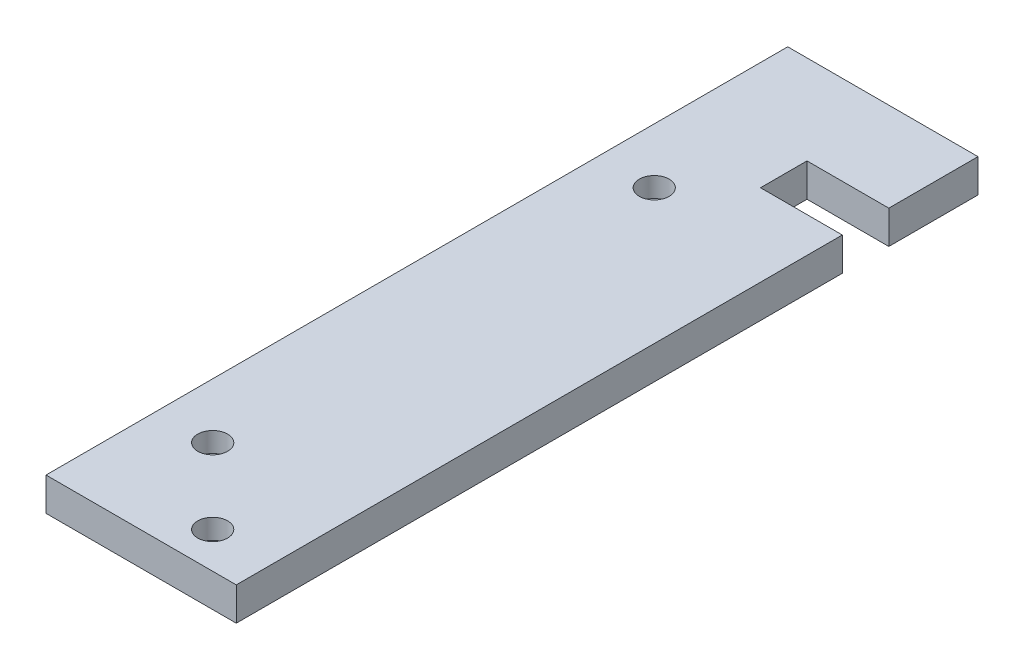
ISO-10303-21;
HEADER;
FILE_DESCRIPTION(('STEP AP214'),'2;1');
FILE_NAME('part.step','',(''),(''),'','','');
FILE_SCHEMA(('AUTOMOTIVE_DESIGN { 1 0 10303 214 1 1 1 1 }'));
ENDSEC;
DATA;
#1=APPLICATION_CONTEXT('core data for automotive mechanical design processes');
#2=APPLICATION_PROTOCOL_DEFINITION('international standard','automotive_design',2000,#1);
#3=PRODUCT_CONTEXT('',#1,'mechanical');
#4=PRODUCT('Part','Part','',(#3));
#5=PRODUCT_RELATED_PRODUCT_CATEGORY('part','',(#4));
#6=PRODUCT_DEFINITION_FORMATION('','',#4);
#7=PRODUCT_DEFINITION_CONTEXT('part definition',#1,'design');
#8=PRODUCT_DEFINITION('design','',#6,#7);
#9=PRODUCT_DEFINITION_SHAPE('','',#8);
#10=(LENGTH_UNIT() NAMED_UNIT(*) SI_UNIT(.MILLI.,.METRE.));
#11=(NAMED_UNIT(*) PLANE_ANGLE_UNIT() SI_UNIT($,.RADIAN.));
#12=(NAMED_UNIT(*) SI_UNIT($,.STERADIAN.) SOLID_ANGLE_UNIT());
#13=UNCERTAINTY_MEASURE_WITH_UNIT(LENGTH_MEASURE(1.E-05),#10,'distance_accuracy_value','');
#14=(GEOMETRIC_REPRESENTATION_CONTEXT(3) GLOBAL_UNCERTAINTY_ASSIGNED_CONTEXT((#13)) GLOBAL_UNIT_ASSIGNED_CONTEXT((#10,
#11,#12)) REPRESENTATION_CONTEXT('',''));
#15=CARTESIAN_POINT('',(0.,0.,0.));
#16=DIRECTION('',(0.,0.,1.));
#17=DIRECTION('',(1.,0.,0.));
#18=AXIS2_PLACEMENT_3D('',#15,#16,#17);
#19=CARTESIAN_POINT('',(-20.3137084989848,5.,-16.7637084989848));
#20=DIRECTION('',(0.,-1.,0.));
#21=DIRECTION('',(0.,0.,-1.));
#22=AXIS2_PLACEMENT_3D('',#19,#20,#21);
#23=CYLINDRICAL_SURFACE('',#22,1.5);
#24=CARTESIAN_POINT('',(-20.3137084989848,0.,-16.7637084989848));
#25=DIRECTION('',(0.,1.,0.));
#26=DIRECTION('',(0.,0.,1.));
#27=AXIS2_PLACEMENT_3D('',#24,#25,#26);
#28=CIRCLE('',#27,1.5);
#29=CARTESIAN_POINT('',(-20.3137084989848,0.,-15.2637084989848));
#30=VERTEX_POINT('',#29);
#31=EDGE_CURVE('E223',#30,#30,#28,.T.);
#32=ORIENTED_EDGE('',*,*,#31,.F.);
#33=EDGE_LOOP('',(#32));
#34=FACE_BOUND('',#33,.T.);
#35=CARTESIAN_POINT('',(-20.3137084989848,2.,-16.7637084989848));
#36=DIRECTION('',(0.,1.,0.));
#37=DIRECTION('',(0.,0.,1.));
#38=AXIS2_PLACEMENT_3D('',#35,#36,#37);
#39=CIRCLE('',#38,1.5);
#40=CARTESIAN_POINT('',(-20.3137084989848,2.,-15.2637084989848));
#41=VERTEX_POINT('',#40);
#42=EDGE_CURVE('E124',#41,#41,#39,.T.);
#43=ORIENTED_EDGE('',*,*,#42,.T.);
#44=EDGE_LOOP('',(#43));
#45=FACE_BOUND('',#44,.T.);
#46=ADVANCED_FACE('F120',(#34,#45),#23,.F.);
#47=CARTESIAN_POINT('',(-9.,5.,-5.45));
#48=DIRECTION('',(0.,-1.,0.));
#49=DIRECTION('',(0.,0.,-1.));
#50=AXIS2_PLACEMENT_3D('',#47,#48,#49);
#51=CYLINDRICAL_SURFACE('',#50,1.5);
#52=CARTESIAN_POINT('',(-9.,0.,-5.45));
#53=DIRECTION('',(0.,1.,0.));
#54=DIRECTION('',(0.,0.,1.));
#55=AXIS2_PLACEMENT_3D('',#52,#53,#54);
#56=CIRCLE('',#55,1.5);
#57=CARTESIAN_POINT('',(-9.,0.,-3.95));
#58=VERTEX_POINT('',#57);
#59=EDGE_CURVE('E260',#58,#58,#56,.T.);
#60=ORIENTED_EDGE('',*,*,#59,.F.);
#61=EDGE_LOOP('',(#60));
#62=FACE_BOUND('',#61,.T.);
#63=CARTESIAN_POINT('',(-9.,2.,-5.45));
#64=DIRECTION('',(0.,1.,0.));
#65=DIRECTION('',(0.,0.,1.));
#66=AXIS2_PLACEMENT_3D('',#63,#64,#65);
#67=CIRCLE('',#66,1.5);
#68=CARTESIAN_POINT('',(-9.,2.,-3.95));
#69=VERTEX_POINT('',#68);
#70=EDGE_CURVE('E250',#69,#69,#67,.T.);
#71=ORIENTED_EDGE('',*,*,#70,.T.);
#72=EDGE_LOOP('',(#71));
#73=FACE_BOUND('',#72,.T.);
#74=ADVANCED_FACE('F297',(#62,#73),#51,.F.);
#75=CARTESIAN_POINT('',(-20.3137084989848,5.,-83.2317459305205));
#76=DIRECTION('',(0.,-1.,0.));
#77=DIRECTION('',(0.,0.,-1.));
#78=AXIS2_PLACEMENT_3D('',#75,#76,#77);
#79=CYLINDRICAL_SURFACE('',#78,1.5);
#80=CARTESIAN_POINT('',(-20.3137084989848,0.,-83.2317459305205));
#81=DIRECTION('',(0.,1.,0.));
#82=DIRECTION('',(0.,0.,1.));
#83=AXIS2_PLACEMENT_3D('',#80,#81,#82);
#84=CIRCLE('',#83,1.5);
#85=CARTESIAN_POINT('',(-20.3137084989848,0.,-81.7317459305205));
#86=VERTEX_POINT('',#85);
#87=EDGE_CURVE('E256',#86,#86,#84,.T.);
#88=ORIENTED_EDGE('',*,*,#87,.F.);
#89=EDGE_LOOP('',(#88));
#90=FACE_BOUND('',#89,.T.);
#91=CARTESIAN_POINT('',(-20.3137084989848,2.,-83.2317459305205));
#92=DIRECTION('',(0.,1.,0.));
#93=DIRECTION('',(0.,0.,1.));
#94=AXIS2_PLACEMENT_3D('',#91,#92,#93);
#95=CIRCLE('',#94,1.5);
#96=CARTESIAN_POINT('',(-20.3137084989848,2.,-81.7317459305205));
#97=VERTEX_POINT('',#96);
#98=EDGE_CURVE('E248',#97,#97,#95,.T.);
#99=ORIENTED_EDGE('',*,*,#98,.T.);
#100=EDGE_LOOP('',(#99));
#101=FACE_BOUND('',#100,.T.);
#102=ADVANCED_FACE('F303',(#90,#101),#79,.F.);
#103=CARTESIAN_POINT('',(0.,5.,-98.2317459305205));
#104=DIRECTION('',(0.,0.,1.));
#105=DIRECTION('',(1.,0.,0.));
#106=AXIS2_PLACEMENT_3D('',#103,#104,#105);
#107=PLANE('',#106);
#108=DIRECTION('',(-1.,0.,0.));
#109=VECTOR('',#108,1.);
#110=CARTESIAN_POINT('',(0.,0.,-98.2317459305205));
#111=LINE('',#110,#109);
#112=CARTESIAN_POINT('',(0.,0.,-98.2317459305205));
#113=VERTEX_POINT('',#112);
#114=CARTESIAN_POINT('',(-12.3137084989848,0.,-98.2317459305205));
#115=VERTEX_POINT('',#114);
#116=EDGE_CURVE('E222',#113,#115,#111,.T.);
#117=ORIENTED_EDGE('',*,*,#116,.F.);
#118=DIRECTION('',(0.,-1.,0.));
#119=VECTOR('',#118,1.);
#120=CARTESIAN_POINT('',(0.,5.,-98.2317459305205));
#121=LINE('',#120,#119);
#122=CARTESIAN_POINT('',(0.,5.,-98.2317459305205));
#123=VERTEX_POINT('',#122);
#124=EDGE_CURVE('E130',#123,#113,#121,.T.);
#125=ORIENTED_EDGE('',*,*,#124,.F.);
#126=DIRECTION('',(-1.,0.,0.));
#127=VECTOR('',#126,1.);
#128=CARTESIAN_POINT('',(0.,5.,-98.2317459305205));
#129=LINE('',#128,#127);
#130=CARTESIAN_POINT('',(-12.3137084989848,5.,-98.2317459305205));
#131=VERTEX_POINT('',#130);
#132=EDGE_CURVE('E271',#123,#131,#129,.T.);
#133=ORIENTED_EDGE('',*,*,#132,.T.);
#134=DIRECTION('',(0.,-1.,0.));
#135=VECTOR('',#134,1.);
#136=CARTESIAN_POINT('',(-12.3137084989848,5.,-98.2317459305205));
#137=LINE('',#136,#135);
#138=EDGE_CURVE('E13',#131,#115,#137,.T.);
#139=ORIENTED_EDGE('',*,*,#138,.T.);
#140=EDGE_LOOP('',(#117,#125,#133,#139));
#141=FACE_BOUND('',#140,.T.);
#142=ADVANCED_FACE('F309',(#141),#107,.T.);
#143=CARTESIAN_POINT('',(0.,5.,0.));
#144=DIRECTION('',(-1.,0.,0.));
#145=DIRECTION('',(0.,0.,1.));
#146=AXIS2_PLACEMENT_3D('',#143,#144,#145);
#147=PLANE('',#146);
#148=DIRECTION('',(0.,0.,-1.));
#149=VECTOR('',#148,1.);
#150=CARTESIAN_POINT('',(0.,0.,0.));
#151=LINE('',#150,#149);
#152=CARTESIAN_POINT('',(0.,0.,-111.659225790131));
#153=VERTEX_POINT('',#152);
#154=EDGE_CURVE('E226',#113,#153,#151,.T.);
#155=ORIENTED_EDGE('',*,*,#154,.T.);
#156=DIRECTION('',(0.,-1.,0.));
#157=VECTOR('',#156,1.);
#158=CARTESIAN_POINT('',(0.,5.,-111.659225790131));
#159=LINE('',#158,#157);
#160=CARTESIAN_POINT('',(0.,5.,-111.659225790131));
#161=VERTEX_POINT('',#160);
#162=EDGE_CURVE('E244',#161,#153,#159,.T.);
#163=ORIENTED_EDGE('',*,*,#162,.F.);
#164=DIRECTION('',(0.,0.,-1.));
#165=VECTOR('',#164,1.);
#166=CARTESIAN_POINT('',(0.,5.,0.));
#167=LINE('',#166,#165);
#168=EDGE_CURVE('E209',#123,#161,#167,.T.);
#169=ORIENTED_EDGE('',*,*,#168,.F.);
#170=ORIENTED_EDGE('',*,*,#124,.T.);
#171=EDGE_LOOP('',(#155,#163,#169,#170));
#172=FACE_BOUND('',#171,.T.);
#173=ADVANCED_FACE('F444',(#172),#147,.F.);
#174=CARTESIAN_POINT('',(0.,5.,-111.659225790131));
#175=DIRECTION('',(0.,0.,1.));
#176=DIRECTION('',(1.,0.,0.));
#177=AXIS2_PLACEMENT_3D('',#174,#175,#176);
#178=PLANE('',#177);
#179=DIRECTION('',(-1.,0.,0.));
#180=VECTOR('',#179,1.);
#181=CARTESIAN_POINT('',(0.,0.,-111.659225790131));
#182=LINE('',#181,#180);
#183=CARTESIAN_POINT('',(-28.6421358331211,0.,-111.659225790131));
#184=VERTEX_POINT('',#183);
#185=EDGE_CURVE('E229',#153,#184,#182,.T.);
#186=ORIENTED_EDGE('',*,*,#185,.T.);
#187=DIRECTION('',(0.,-1.,0.));
#188=VECTOR('',#187,1.);
#189=CARTESIAN_POINT('',(-28.6421358331211,5.,-111.659225790131));
#190=LINE('',#189,#188);
#191=CARTESIAN_POINT('',(-28.6421358331211,5.,-111.659225790131));
#192=VERTEX_POINT('',#191);
#193=EDGE_CURVE('E242',#192,#184,#190,.T.);
#194=ORIENTED_EDGE('',*,*,#193,.F.);
#195=DIRECTION('',(-1.,0.,0.));
#196=VECTOR('',#195,1.);
#197=CARTESIAN_POINT('',(0.,5.,-111.659225790131));
#198=LINE('',#197,#196);
#199=EDGE_CURVE('E215',#161,#192,#198,.T.);
#200=ORIENTED_EDGE('',*,*,#199,.F.);
#201=ORIENTED_EDGE('',*,*,#162,.T.);
#202=EDGE_LOOP('',(#186,#194,#200,#201));
#203=FACE_BOUND('',#202,.T.);
#204=ADVANCED_FACE('F279',(#203),#178,.F.);
#205=CARTESIAN_POINT('',(-28.6421358331211,5.,0.));
#206=DIRECTION('',(-1.,0.,0.));
#207=DIRECTION('',(0.,0.,1.));
#208=AXIS2_PLACEMENT_3D('',#205,#206,#207);
#209=PLANE('',#208);
#210=DIRECTION('',(0.,0.,-1.));
#211=VECTOR('',#210,1.);
#212=CARTESIAN_POINT('',(-28.6421358331211,0.,0.));
#213=LINE('',#212,#211);
#214=CARTESIAN_POINT('',(-28.6421358331211,0.,0.));
#215=VERTEX_POINT('',#214);
#216=EDGE_CURVE('E233',#215,#184,#213,.T.);
#217=ORIENTED_EDGE('',*,*,#216,.F.);
#218=DIRECTION('',(0.,-1.,0.));
#219=VECTOR('',#218,1.);
#220=CARTESIAN_POINT('',(-28.6421358331211,5.,0.));
#221=LINE('',#220,#219);
#222=CARTESIAN_POINT('',(-28.6421358331211,5.,0.));
#223=VERTEX_POINT('',#222);
#224=EDGE_CURVE('E202',#223,#215,#221,.T.);
#225=ORIENTED_EDGE('',*,*,#224,.F.);
#226=DIRECTION('',(0.,0.,-1.));
#227=VECTOR('',#226,1.);
#228=CARTESIAN_POINT('',(-28.6421358331211,5.,0.));
#229=LINE('',#228,#227);
#230=EDGE_CURVE('E213',#223,#192,#229,.T.);
#231=ORIENTED_EDGE('',*,*,#230,.T.);
#232=ORIENTED_EDGE('',*,*,#193,.T.);
#233=EDGE_LOOP('',(#217,#225,#231,#232));
#234=FACE_BOUND('',#233,.T.);
#235=ADVANCED_FACE('F282',(#234),#209,.T.);
#236=CARTESIAN_POINT('',(0.,5.,0.));
#237=DIRECTION('',(0.,0.,1.));
#238=DIRECTION('',(1.,0.,0.));
#239=AXIS2_PLACEMENT_3D('',#236,#237,#238);
#240=PLANE('',#239);
#241=DIRECTION('',(-1.,0.,0.));
#242=VECTOR('',#241,1.);
#243=CARTESIAN_POINT('',(0.,0.,0.));
#244=LINE('',#243,#242);
#245=CARTESIAN_POINT('',(0.,0.,0.));
#246=VERTEX_POINT('',#245);
#247=EDGE_CURVE('E199',#246,#215,#244,.T.);
#248=ORIENTED_EDGE('',*,*,#247,.F.);
#249=DIRECTION('',(0.,-1.,0.));
#250=VECTOR('',#249,1.);
#251=CARTESIAN_POINT('',(0.,5.,0.));
#252=LINE('',#251,#250);
#253=CARTESIAN_POINT('',(0.,5.,0.));
#254=VERTEX_POINT('',#253);
#255=EDGE_CURVE('E193',#254,#246,#252,.T.);
#256=ORIENTED_EDGE('',*,*,#255,.F.);
#257=DIRECTION('',(-1.,0.,0.));
#258=VECTOR('',#257,1.);
#259=CARTESIAN_POINT('',(0.,5.,0.));
#260=LINE('',#259,#258);
#261=EDGE_CURVE('E197',#254,#223,#260,.T.);
#262=ORIENTED_EDGE('',*,*,#261,.T.);
#263=ORIENTED_EDGE('',*,*,#224,.T.);
#264=EDGE_LOOP('',(#248,#256,#262,#263));
#265=FACE_BOUND('',#264,.T.);
#266=ADVANCED_FACE('F195',(#265),#240,.T.);
#267=CARTESIAN_POINT('',(0.,0.,-91.2317459305205));
#268=VERTEX_POINT('',#267);
#269=EDGE_CURVE('E230',#246,#268,#151,.T.);
#270=ORIENTED_EDGE('',*,*,#269,.T.);
#271=DIRECTION('',(0.,-1.,0.));
#272=VECTOR('',#271,1.);
#273=CARTESIAN_POINT('',(0.,5.,-91.2317459305205));
#274=LINE('',#273,#272);
#275=CARTESIAN_POINT('',(0.,5.,-91.2317459305205));
#276=VERTEX_POINT('',#275);
#277=EDGE_CURVE('E203',#276,#268,#274,.T.);
#278=ORIENTED_EDGE('',*,*,#277,.F.);
#279=EDGE_CURVE('E206',#254,#276,#167,.T.);
#280=ORIENTED_EDGE('',*,*,#279,.F.);
#281=ORIENTED_EDGE('',*,*,#255,.T.);
#282=EDGE_LOOP('',(#270,#278,#280,#281));
#283=FACE_BOUND('',#282,.T.);
#284=ADVANCED_FACE('F207',(#283),#147,.F.);
#285=CARTESIAN_POINT('',(0.,5.,-91.2317459305205));
#286=DIRECTION('',(0.,0.,1.));
#287=DIRECTION('',(1.,0.,0.));
#288=AXIS2_PLACEMENT_3D('',#285,#286,#287);
#289=PLANE('',#288);
#290=DIRECTION('',(-1.,0.,0.));
#291=VECTOR('',#290,1.);
#292=CARTESIAN_POINT('',(0.,0.,-91.2317459305205));
#293=LINE('',#292,#291);
#294=CARTESIAN_POINT('',(-12.3137084989848,0.,-91.2317459305205));
#295=VERTEX_POINT('',#294);
#296=EDGE_CURVE('E167',#268,#295,#293,.T.);
#297=ORIENTED_EDGE('',*,*,#296,.T.);
#298=DIRECTION('',(0.,-1.,0.));
#299=VECTOR('',#298,1.);
#300=CARTESIAN_POINT('',(-12.3137084989848,5.,-91.2317459305205));
#301=LINE('',#300,#299);
#302=CARTESIAN_POINT('',(-12.3137084989848,5.,-91.2317459305205));
#303=VERTEX_POINT('',#302);
#304=EDGE_CURVE('E174',#303,#295,#301,.T.);
#305=ORIENTED_EDGE('',*,*,#304,.F.);
#306=DIRECTION('',(-1.,0.,0.));
#307=VECTOR('',#306,1.);
#308=CARTESIAN_POINT('',(0.,5.,-91.2317459305205));
#309=LINE('',#308,#307);
#310=EDGE_CURVE('E139',#276,#303,#309,.T.);
#311=ORIENTED_EDGE('',*,*,#310,.F.);
#312=ORIENTED_EDGE('',*,*,#277,.T.);
#313=EDGE_LOOP('',(#297,#305,#311,#312));
#314=FACE_BOUND('',#313,.T.);
#315=ADVANCED_FACE('F293',(#314),#289,.F.);
#316=CARTESIAN_POINT('',(-12.3137084989848,5.,0.));
#317=DIRECTION('',(1.,0.,0.));
#318=DIRECTION('',(0.,0.,-1.));
#319=AXIS2_PLACEMENT_3D('',#316,#317,#318);
#320=PLANE('',#319);
#321=DIRECTION('',(0.,0.,1.));
#322=VECTOR('',#321,1.);
#323=CARTESIAN_POINT('',(-12.3137084989848,0.,0.));
#324=LINE('',#323,#322);
#325=EDGE_CURVE('E220',#115,#295,#324,.T.);
#326=ORIENTED_EDGE('',*,*,#325,.F.);
#327=ORIENTED_EDGE('',*,*,#138,.F.);
#328=DIRECTION('',(0.,0.,1.));
#329=VECTOR('',#328,1.);
#330=CARTESIAN_POINT('',(-12.3137084989848,5.,0.));
#331=LINE('',#330,#329);
#332=EDGE_CURVE('E238',#131,#303,#331,.T.);
#333=ORIENTED_EDGE('',*,*,#332,.T.);
#334=ORIENTED_EDGE('',*,*,#304,.T.);
#335=EDGE_LOOP('',(#326,#327,#333,#334));
#336=FACE_BOUND('',#335,.T.);
#337=ADVANCED_FACE('F122',(#336),#320,.T.);
#338=CARTESIAN_POINT('',(0.,0.,0.));
#339=DIRECTION('',(0.,1.,0.));
#340=DIRECTION('',(0.,0.,1.));
#341=AXIS2_PLACEMENT_3D('',#338,#339,#340);
#342=PLANE('',#341);
#343=ORIENTED_EDGE('',*,*,#87,.T.);
#344=EDGE_LOOP('',(#343));
#345=FACE_BOUND('',#344,.T.);
#346=ORIENTED_EDGE('',*,*,#59,.T.);
#347=EDGE_LOOP('',(#346));
#348=FACE_BOUND('',#347,.T.);
#349=ORIENTED_EDGE('',*,*,#31,.T.);
#350=EDGE_LOOP('',(#349));
#351=FACE_BOUND('',#350,.T.);
#352=ORIENTED_EDGE('',*,*,#325,.T.);
#353=ORIENTED_EDGE('',*,*,#296,.F.);
#354=ORIENTED_EDGE('',*,*,#269,.F.);
#355=ORIENTED_EDGE('',*,*,#247,.T.);
#356=ORIENTED_EDGE('',*,*,#216,.T.);
#357=ORIENTED_EDGE('',*,*,#185,.F.);
#358=ORIENTED_EDGE('',*,*,#154,.F.);
#359=ORIENTED_EDGE('',*,*,#116,.T.);
#360=EDGE_LOOP('',(#352,#353,#354,#355,#356,#357,#358,#359));
#361=FACE_BOUND('',#360,.T.);
#362=ADVANCED_FACE('F283',(#345,#348,#351,#361),#342,.F.);
#363=CARTESIAN_POINT('',(0.,5.,0.));
#364=DIRECTION('',(0.,1.,0.));
#365=DIRECTION('',(0.,0.,1.));
#366=AXIS2_PLACEMENT_3D('',#363,#364,#365);
#367=PLANE('',#366);
#368=CARTESIAN_POINT('',(-20.3137084989848,5.,-83.2317459305205));
#369=DIRECTION('',(0.,1.,0.));
#370=DIRECTION('',(0.,0.,1.));
#371=AXIS2_PLACEMENT_3D('',#368,#369,#370);
#372=CIRCLE('',#371,2.25);
#373=CARTESIAN_POINT('',(-20.3137084989848,5.,-80.9817459305205));
#374=VERTEX_POINT('',#373);
#375=EDGE_CURVE('E340',#374,#374,#372,.T.);
#376=ORIENTED_EDGE('',*,*,#375,.F.);
#377=EDGE_LOOP('',(#376));
#378=FACE_BOUND('',#377,.T.);
#379=CARTESIAN_POINT('',(-20.3137084989848,5.,-16.7637084989848));
#380=DIRECTION('',(0.,1.,0.));
#381=DIRECTION('',(0.,0.,1.));
#382=AXIS2_PLACEMENT_3D('',#379,#380,#381);
#383=CIRCLE('',#382,2.25);
#384=CARTESIAN_POINT('',(-20.3137084989848,5.,-14.5137084989848));
#385=VERTEX_POINT('',#384);
#386=EDGE_CURVE('E343',#385,#385,#383,.T.);
#387=ORIENTED_EDGE('',*,*,#386,.F.);
#388=EDGE_LOOP('',(#387));
#389=FACE_BOUND('',#388,.T.);
#390=CARTESIAN_POINT('',(-9.,5.,-5.45));
#391=DIRECTION('',(0.,1.,0.));
#392=DIRECTION('',(0.,0.,1.));
#393=AXIS2_PLACEMENT_3D('',#390,#391,#392);
#394=CIRCLE('',#393,2.25);
#395=CARTESIAN_POINT('',(-9.,5.,-3.2));
#396=VERTEX_POINT('',#395);
#397=EDGE_CURVE('E349',#396,#396,#394,.T.);
#398=ORIENTED_EDGE('',*,*,#397,.F.);
#399=EDGE_LOOP('',(#398));
#400=FACE_BOUND('',#399,.T.);
#401=ORIENTED_EDGE('',*,*,#332,.F.);
#402=ORIENTED_EDGE('',*,*,#132,.F.);
#403=ORIENTED_EDGE('',*,*,#168,.T.);
#404=ORIENTED_EDGE('',*,*,#199,.T.);
#405=ORIENTED_EDGE('',*,*,#230,.F.);
#406=ORIENTED_EDGE('',*,*,#261,.F.);
#407=ORIENTED_EDGE('',*,*,#279,.T.);
#408=ORIENTED_EDGE('',*,*,#310,.T.);
#409=EDGE_LOOP('',(#401,#402,#403,#404,#405,#406,#407,#408));
#410=FACE_BOUND('',#409,.T.);
#411=ADVANCED_FACE('F211',(#378,#389,#400,#410),#367,.T.);
#412=CARTESIAN_POINT('',(-20.3137084989848,-6.36396103067892,-83.2317459305205));
#413=DIRECTION('',(0.,1.,0.));
#414=DIRECTION('',(0.,0.,1.));
#415=AXIS2_PLACEMENT_3D('',#412,#413,#414);
#416=CYLINDRICAL_SURFACE('',#415,2.25);
#417=CARTESIAN_POINT('',(-20.3137084989848,2.,-83.2317459305205));
#418=DIRECTION('',(0.,1.,0.));
#419=DIRECTION('',(0.,0.,1.));
#420=AXIS2_PLACEMENT_3D('',#417,#418,#419);
#421=CIRCLE('',#420,2.25);
#422=CARTESIAN_POINT('',(-20.3137084989848,2.,-80.9817459305205));
#423=VERTEX_POINT('',#422);
#424=EDGE_CURVE('E251',#423,#423,#421,.F.);
#425=ORIENTED_EDGE('',*,*,#424,.T.);
#426=EDGE_LOOP('',(#425));
#427=FACE_BOUND('',#426,.T.);
#428=ORIENTED_EDGE('',*,*,#375,.T.);
#429=EDGE_LOOP('',(#428));
#430=FACE_BOUND('',#429,.T.);
#431=ADVANCED_FACE('F290',(#427,#430),#416,.F.);
#432=CARTESIAN_POINT('',(0.,2.,0.));
#433=DIRECTION('',(0.,1.,0.));
#434=DIRECTION('',(0.,0.,1.));
#435=AXIS2_PLACEMENT_3D('',#432,#433,#434);
#436=PLANE('',#435);
#437=ORIENTED_EDGE('',*,*,#98,.F.);
#438=EDGE_LOOP('',(#437));
#439=FACE_BOUND('',#438,.T.);
#440=ORIENTED_EDGE('',*,*,#424,.F.);
#441=EDGE_LOOP('',(#440));
#442=FACE_BOUND('',#441,.T.);
#443=ADVANCED_FACE('F320',(#439,#442),#436,.T.);
#444=CARTESIAN_POINT('',(-9.,-6.36396103067892,-5.45));
#445=DIRECTION('',(0.,1.,0.));
#446=DIRECTION('',(0.,0.,1.));
#447=AXIS2_PLACEMENT_3D('',#444,#445,#446);
#448=CYLINDRICAL_SURFACE('',#447,2.25);
#449=CARTESIAN_POINT('',(-9.,2.,-5.45));
#450=DIRECTION('',(0.,1.,0.));
#451=DIRECTION('',(0.,0.,1.));
#452=AXIS2_PLACEMENT_3D('',#449,#450,#451);
#453=CIRCLE('',#452,2.25);
#454=CARTESIAN_POINT('',(-9.,2.,-3.2));
#455=VERTEX_POINT('',#454);
#456=EDGE_CURVE('E352',#455,#455,#453,.F.);
#457=ORIENTED_EDGE('',*,*,#456,.T.);
#458=EDGE_LOOP('',(#457));
#459=FACE_BOUND('',#458,.T.);
#460=ORIENTED_EDGE('',*,*,#397,.T.);
#461=EDGE_LOOP('',(#460));
#462=FACE_BOUND('',#461,.T.);
#463=ADVANCED_FACE('F316',(#459,#462),#448,.F.);
#464=CARTESIAN_POINT('',(0.,2.,0.));
#465=DIRECTION('',(0.,1.,0.));
#466=DIRECTION('',(0.,0.,1.));
#467=AXIS2_PLACEMENT_3D('',#464,#465,#466);
#468=PLANE('',#467);
#469=ORIENTED_EDGE('',*,*,#70,.F.);
#470=EDGE_LOOP('',(#469));
#471=FACE_BOUND('',#470,.T.);
#472=ORIENTED_EDGE('',*,*,#456,.F.);
#473=EDGE_LOOP('',(#472));
#474=FACE_BOUND('',#473,.T.);
#475=ADVANCED_FACE('F312',(#471,#474),#468,.T.);
#476=CARTESIAN_POINT('',(-20.3137084989848,-6.36396103067892,-16.7637084989848));
#477=DIRECTION('',(0.,1.,0.));
#478=DIRECTION('',(0.,0.,1.));
#479=AXIS2_PLACEMENT_3D('',#476,#477,#478);
#480=CYLINDRICAL_SURFACE('',#479,2.25);
#481=CARTESIAN_POINT('',(-20.3137084989848,2.,-16.7637084989848));
#482=DIRECTION('',(0.,1.,0.));
#483=DIRECTION('',(0.,0.,1.));
#484=AXIS2_PLACEMENT_3D('',#481,#482,#483);
#485=CIRCLE('',#484,2.25);
#486=CARTESIAN_POINT('',(-20.3137084989848,2.,-14.5137084989848));
#487=VERTEX_POINT('',#486);
#488=EDGE_CURVE('E346',#487,#487,#485,.F.);
#489=ORIENTED_EDGE('',*,*,#488,.T.);
#490=EDGE_LOOP('',(#489));
#491=FACE_BOUND('',#490,.T.);
#492=ORIENTED_EDGE('',*,*,#386,.T.);
#493=EDGE_LOOP('',(#492));
#494=FACE_BOUND('',#493,.T.);
#495=ADVANCED_FACE('F315',(#491,#494),#480,.F.);
#496=CARTESIAN_POINT('',(0.,2.,0.));
#497=DIRECTION('',(0.,1.,0.));
#498=DIRECTION('',(0.,0.,1.));
#499=AXIS2_PLACEMENT_3D('',#496,#497,#498);
#500=PLANE('',#499);
#501=ORIENTED_EDGE('',*,*,#42,.F.);
#502=EDGE_LOOP('',(#501));
#503=FACE_BOUND('',#502,.T.);
#504=ORIENTED_EDGE('',*,*,#488,.F.);
#505=EDGE_LOOP('',(#504));
#506=FACE_BOUND('',#505,.T.);
#507=ADVANCED_FACE('F322',(#503,#506),#500,.T.);
#508=CLOSED_SHELL('',(#46,#74,#102,#142,#173,#204,#235,#266,#284,#315,#337,#362,#411,#431,#443,
#463,#475,#495,#507));
#509=MANIFOLD_SOLID_BREP('B2',#508);
#510=ADVANCED_BREP_SHAPE_REPRESENTATION('',(#18,#509),#14);
#511=SHAPE_DEFINITION_REPRESENTATION(#9,#510);
ENDSEC;
END-ISO-10303-21;
